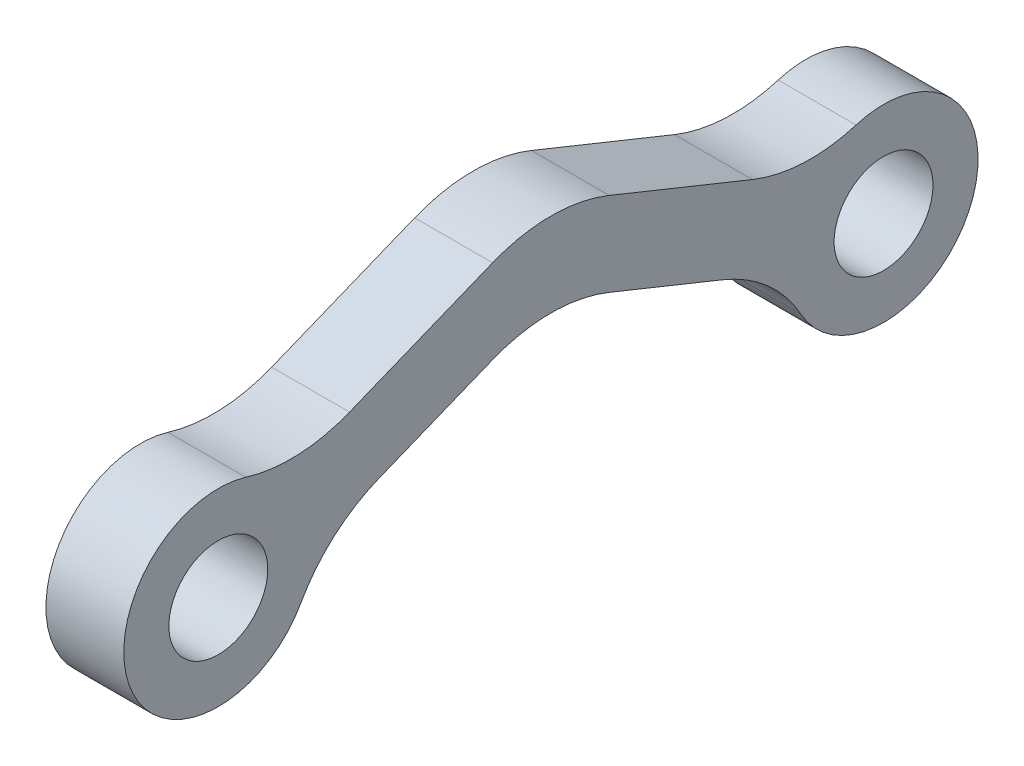
ISO-10303-21;
HEADER;
FILE_DESCRIPTION(('STEP AP214'),'2;1');
FILE_NAME('part.step','',(''),(''),'','','');
FILE_SCHEMA(('AUTOMOTIVE_DESIGN { 1 0 10303 214 1 1 1 1 }'));
ENDSEC;
DATA;
#1=APPLICATION_CONTEXT('core data for automotive mechanical design processes');
#2=APPLICATION_PROTOCOL_DEFINITION('international standard','automotive_design',2000,#1);
#3=PRODUCT_CONTEXT('',#1,'mechanical');
#4=PRODUCT('Part','Part','',(#3));
#5=PRODUCT_RELATED_PRODUCT_CATEGORY('part','',(#4));
#6=PRODUCT_DEFINITION_FORMATION('','',#4);
#7=PRODUCT_DEFINITION_CONTEXT('part definition',#1,'design');
#8=PRODUCT_DEFINITION('design','',#6,#7);
#9=PRODUCT_DEFINITION_SHAPE('','',#8);
#10=(LENGTH_UNIT() NAMED_UNIT(*) SI_UNIT(.MILLI.,.METRE.));
#11=(NAMED_UNIT(*) PLANE_ANGLE_UNIT() SI_UNIT($,.RADIAN.));
#12=(NAMED_UNIT(*) SI_UNIT($,.STERADIAN.) SOLID_ANGLE_UNIT());
#13=UNCERTAINTY_MEASURE_WITH_UNIT(LENGTH_MEASURE(1.E-05),#10,'distance_accuracy_value','');
#14=(GEOMETRIC_REPRESENTATION_CONTEXT(3) GLOBAL_UNCERTAINTY_ASSIGNED_CONTEXT((#13)) GLOBAL_UNIT_ASSIGNED_CONTEXT((#10,
#11,#12)) REPRESENTATION_CONTEXT('',''));
#15=CARTESIAN_POINT('',(0.,0.,0.));
#16=DIRECTION('',(0.,0.,1.));
#17=DIRECTION('',(1.,0.,0.));
#18=AXIS2_PLACEMENT_3D('',#15,#16,#17);
#19=CARTESIAN_POINT('',(5.,15.373044737521,38.0387186051064));
#20=DIRECTION('',(-1.,0.,0.));
#21=DIRECTION('',(0.,0.,1.));
#22=AXIS2_PLACEMENT_3D('',#19,#20,#21);
#23=PLANE('',#22);
#24=CARTESIAN_POINT('',(5.,15.373044737521,38.0387186051064));
#25=DIRECTION('',(-1.,0.,0.));
#26=DIRECTION('',(0.,0.,1.));
#27=AXIS2_PLACEMENT_3D('',#24,#25,#26);
#28=CIRCLE('',#27,10.);
#29=CARTESIAN_POINT('',(5.,6.10120619185315,34.2926526709472));
#30=VERTEX_POINT('',#29);
#31=CARTESIAN_POINT('',(5.,5.80674434080601,40.951774855818));
#32=VERTEX_POINT('',#31);
#33=EDGE_CURVE('E202',#30,#32,#28,.T.);
#34=ORIENTED_EDGE('',*,*,#33,.T.);
#35=CARTESIAN_POINT('',(5.,0.,42.72));
#36=DIRECTION('',(1.,0.,0.));
#37=DIRECTION('',(0.,0.,1.));
#38=AXIS2_PLACEMENT_3D('',#35,#36,#37);
#39=CIRCLE('',#38,6.07);
#40=CARTESIAN_POINT('',(5.,-2.9487099174709,37.414341716374));
#41=VERTEX_POINT('',#40);
#42=EDGE_CURVE('E114',#32,#41,#39,.T.);
#43=ORIENTED_EDGE('',*,*,#42,.T.);
#44=CARTESIAN_POINT('',(5.,-7.80655162664866,28.6735537697085));
#45=DIRECTION('',(-1.,0.,0.));
#46=DIRECTION('',(0.,0.,-1.));
#47=AXIS2_PLACEMENT_3D('',#44,#45,#46);
#48=CIRCLE('',#47,10.);
#49=CARTESIAN_POINT('',(5.,1.46528691901921,32.4196197038677));
#50=VERTEX_POINT('',#49);
#51=EDGE_CURVE('E239',#41,#50,#48,.T.);
#52=ORIENTED_EDGE('',*,*,#51,.T.);
#53=DIRECTION('',(0.,0.374606593415913,-0.927183854566787));
#54=VECTOR('',#53,1.);
#55=CARTESIAN_POINT('',(5.,1.46528691901921,32.4196197038677));
#56=LINE('',#55,#54);
#57=CARTESIAN_POINT('',(5.,4.42015444603704,25.1060659341591));
#58=VERTEX_POINT('',#57);
#59=EDGE_CURVE('E259',#50,#58,#56,.T.);
#60=ORIENTED_EDGE('',*,*,#59,.T.);
#61=CARTESIAN_POINT('',(5.,-4.85168409963083,21.36));
#62=DIRECTION('',(-1.,0.,0.));
#63=DIRECTION('',(0.,0.,-1.));
#64=AXIS2_PLACEMENT_3D('',#61,#62,#63);
#65=CIRCLE('',#64,10.);
#66=CARTESIAN_POINT('',(5.,4.42015444603704,17.6139340658409));
#67=VERTEX_POINT('',#66);
#68=EDGE_CURVE('E255',#58,#67,#65,.T.);
#69=ORIENTED_EDGE('',*,*,#68,.T.);
#70=DIRECTION('',(0.,-0.374606593415913,-0.927183854566787));
#71=VECTOR('',#70,1.);
#72=CARTESIAN_POINT('',(5.,1.46528691901921,10.3003802961323));
#73=LINE('',#72,#71);
#74=CARTESIAN_POINT('',(5.,1.46528691901921,10.3003802961323));
#75=VERTEX_POINT('',#74);
#76=EDGE_CURVE('E258',#67,#75,#73,.T.);
#77=ORIENTED_EDGE('',*,*,#76,.T.);
#78=CARTESIAN_POINT('',(5.,-7.80655162664866,14.0464462302915));
#79=DIRECTION('',(-1.,0.,0.));
#80=DIRECTION('',(0.,0.,1.));
#81=AXIS2_PLACEMENT_3D('',#78,#79,#80);
#82=CIRCLE('',#81,10.);
#83=CARTESIAN_POINT('',(5.,-2.9487099174709,5.30565828362596));
#84=VERTEX_POINT('',#83);
#85=EDGE_CURVE('E263',#75,#84,#82,.T.);
#86=ORIENTED_EDGE('',*,*,#85,.T.);
#87=CARTESIAN_POINT('',(5.,0.,0.));
#88=DIRECTION('',(1.,0.,0.));
#89=DIRECTION('',(0.,0.,-1.));
#90=AXIS2_PLACEMENT_3D('',#87,#88,#89);
#91=CIRCLE('',#90,6.07);
#92=CARTESIAN_POINT('',(5.,5.80674434080601,1.76822514418198));
#93=VERTEX_POINT('',#92);
#94=EDGE_CURVE('E270',#84,#93,#91,.T.);
#95=ORIENTED_EDGE('',*,*,#94,.T.);
#96=CARTESIAN_POINT('',(5.,15.373044737521,4.68128139489364));
#97=DIRECTION('',(-1.,0.,0.));
#98=DIRECTION('',(0.,0.,-1.));
#99=AXIS2_PLACEMENT_3D('',#96,#97,#98);
#100=CIRCLE('',#99,10.);
#101=CARTESIAN_POINT('',(5.,6.10120619185315,8.42734732905277));
#102=VERTEX_POINT('',#101);
#103=EDGE_CURVE('E145',#93,#102,#100,.T.);
#104=ORIENTED_EDGE('',*,*,#103,.T.);
#105=DIRECTION('',(0.,0.374606593415913,0.927183854566787));
#106=VECTOR('',#105,1.);
#107=CARTESIAN_POINT('',(5.,6.10120619185315,8.42734732905277));
#108=LINE('',#107,#106);
#109=CARTESIAN_POINT('',(5.,9.81282815942497,17.6139340658409));
#110=VERTEX_POINT('',#109);
#111=EDGE_CURVE('E139',#102,#110,#108,.T.);
#112=ORIENTED_EDGE('',*,*,#111,.T.);
#113=CARTESIAN_POINT('',(5.,0.540989613757094,21.36));
#114=DIRECTION('',(1.,0.,0.));
#115=DIRECTION('',(0.,0.,-1.));
#116=AXIS2_PLACEMENT_3D('',#113,#114,#115);
#117=CIRCLE('',#116,10.);
#118=CARTESIAN_POINT('',(5.,9.81282815942497,25.1060659341591));
#119=VERTEX_POINT('',#118);
#120=EDGE_CURVE('E143',#110,#119,#117,.T.);
#121=ORIENTED_EDGE('',*,*,#120,.T.);
#122=DIRECTION('',(0.,-0.374606593415913,0.927183854566787));
#123=VECTOR('',#122,1.);
#124=CARTESIAN_POINT('',(5.,6.10120619185315,34.2926526709472));
#125=LINE('',#124,#123);
#126=EDGE_CURVE('E59',#119,#30,#125,.T.);
#127=ORIENTED_EDGE('',*,*,#126,.T.);
#128=EDGE_LOOP('',(#34,#43,#52,#60,#69,#77,#86,#95,#104,#112,#121,#127));
#129=FACE_BOUND('',#128,.T.);
#130=CARTESIAN_POINT('',(5.,0.,0.));
#131=DIRECTION('',(1.,0.,0.));
#132=DIRECTION('',(0.,0.,-1.));
#133=AXIS2_PLACEMENT_3D('',#130,#131,#132);
#134=CIRCLE('',#133,3.175);
#135=CARTESIAN_POINT('',(5.,0.,-3.175));
#136=VERTEX_POINT('',#135);
#137=EDGE_CURVE('E172',#136,#136,#134,.T.);
#138=ORIENTED_EDGE('',*,*,#137,.F.);
#139=EDGE_LOOP('',(#138));
#140=FACE_BOUND('',#139,.T.);
#141=CARTESIAN_POINT('',(5.,0.,42.72));
#142=DIRECTION('',(1.,0.,0.));
#143=DIRECTION('',(0.,0.,-1.));
#144=AXIS2_PLACEMENT_3D('',#141,#142,#143);
#145=CIRCLE('',#144,3.175);
#146=CARTESIAN_POINT('',(5.,0.,39.545));
#147=VERTEX_POINT('',#146);
#148=EDGE_CURVE('E313',#147,#147,#145,.T.);
#149=ORIENTED_EDGE('',*,*,#148,.F.);
#150=EDGE_LOOP('',(#149));
#151=FACE_BOUND('',#150,.T.);
#152=ADVANCED_FACE('F41',(#129,#140,#151),#23,.F.);
#153=CARTESIAN_POINT('',(0.,15.373044737521,38.0387186051064));
#154=DIRECTION('',(-1.,0.,0.));
#155=DIRECTION('',(0.,0.,1.));
#156=AXIS2_PLACEMENT_3D('',#153,#154,#155);
#157=PLANE('',#156);
#158=CARTESIAN_POINT('',(0.,0.,0.));
#159=DIRECTION('',(1.,0.,0.));
#160=DIRECTION('',(0.,0.,-1.));
#161=AXIS2_PLACEMENT_3D('',#158,#159,#160);
#162=CIRCLE('',#161,3.175);
#163=CARTESIAN_POINT('',(0.,0.,-3.175));
#164=VERTEX_POINT('',#163);
#165=EDGE_CURVE('E320',#164,#164,#162,.T.);
#166=ORIENTED_EDGE('',*,*,#165,.T.);
#167=EDGE_LOOP('',(#166));
#168=FACE_BOUND('',#167,.T.);
#169=CARTESIAN_POINT('',(0.,15.373044737521,38.0387186051064));
#170=DIRECTION('',(-1.,0.,0.));
#171=DIRECTION('',(0.,0.,1.));
#172=AXIS2_PLACEMENT_3D('',#169,#170,#171);
#173=CIRCLE('',#172,10.);
#174=CARTESIAN_POINT('',(0.,6.10120619185315,34.2926526709472));
#175=VERTEX_POINT('',#174);
#176=CARTESIAN_POINT('',(0.,5.80674434080601,40.951774855818));
#177=VERTEX_POINT('',#176);
#178=EDGE_CURVE('E167',#175,#177,#173,.T.);
#179=ORIENTED_EDGE('',*,*,#178,.F.);
#180=DIRECTION('',(0.,-0.374606593415913,0.927183854566787));
#181=VECTOR('',#180,1.);
#182=CARTESIAN_POINT('',(0.,6.10120619185315,34.2926526709472));
#183=LINE('',#182,#181);
#184=CARTESIAN_POINT('',(0.,9.81282815942497,25.1060659341591));
#185=VERTEX_POINT('',#184);
#186=EDGE_CURVE('E106',#185,#175,#183,.T.);
#187=ORIENTED_EDGE('',*,*,#186,.F.);
#188=CARTESIAN_POINT('',(0.,0.540989613757094,21.36));
#189=DIRECTION('',(1.,0.,0.));
#190=DIRECTION('',(0.,0.,-1.));
#191=AXIS2_PLACEMENT_3D('',#188,#189,#190);
#192=CIRCLE('',#191,10.);
#193=CARTESIAN_POINT('',(0.,9.81282815942497,17.6139340658409));
#194=VERTEX_POINT('',#193);
#195=EDGE_CURVE('E100',#194,#185,#192,.T.);
#196=ORIENTED_EDGE('',*,*,#195,.F.);
#197=DIRECTION('',(0.,0.374606593415913,0.927183854566787));
#198=VECTOR('',#197,1.);
#199=CARTESIAN_POINT('',(0.,6.10120619185315,8.42734732905277));
#200=LINE('',#199,#198);
#201=CARTESIAN_POINT('',(0.,6.10120619185315,8.42734732905277));
#202=VERTEX_POINT('',#201);
#203=EDGE_CURVE('E154',#202,#194,#200,.T.);
#204=ORIENTED_EDGE('',*,*,#203,.F.);
#205=CARTESIAN_POINT('',(0.,15.373044737521,4.68128139489364));
#206=DIRECTION('',(-1.,0.,0.));
#207=DIRECTION('',(0.,0.,-1.));
#208=AXIS2_PLACEMENT_3D('',#205,#206,#207);
#209=CIRCLE('',#208,10.);
#210=CARTESIAN_POINT('',(0.,5.80674434080601,1.76822514418198));
#211=VERTEX_POINT('',#210);
#212=EDGE_CURVE('E193',#211,#202,#209,.T.);
#213=ORIENTED_EDGE('',*,*,#212,.F.);
#214=CARTESIAN_POINT('',(0.,0.,0.));
#215=DIRECTION('',(1.,0.,0.));
#216=DIRECTION('',(0.,0.,-1.));
#217=AXIS2_PLACEMENT_3D('',#214,#215,#216);
#218=CIRCLE('',#217,6.07);
#219=CARTESIAN_POINT('',(0.,-2.9487099174709,5.30565828362596));
#220=VERTEX_POINT('',#219);
#221=EDGE_CURVE('E190',#220,#211,#218,.T.);
#222=ORIENTED_EDGE('',*,*,#221,.F.);
#223=CARTESIAN_POINT('',(0.,-7.80655162664866,14.0464462302915));
#224=DIRECTION('',(-1.,0.,0.));
#225=DIRECTION('',(0.,0.,1.));
#226=AXIS2_PLACEMENT_3D('',#223,#224,#225);
#227=CIRCLE('',#226,10.);
#228=CARTESIAN_POINT('',(0.,1.46528691901921,10.3003802961323));
#229=VERTEX_POINT('',#228);
#230=EDGE_CURVE('E187',#229,#220,#227,.T.);
#231=ORIENTED_EDGE('',*,*,#230,.F.);
#232=DIRECTION('',(0.,-0.374606593415913,-0.927183854566787));
#233=VECTOR('',#232,1.);
#234=CARTESIAN_POINT('',(0.,1.46528691901921,10.3003802961323));
#235=LINE('',#234,#233);
#236=CARTESIAN_POINT('',(0.,4.42015444603704,17.6139340658409));
#237=VERTEX_POINT('',#236);
#238=EDGE_CURVE('E184',#237,#229,#235,.T.);
#239=ORIENTED_EDGE('',*,*,#238,.F.);
#240=CARTESIAN_POINT('',(0.,-4.85168409963083,21.36));
#241=DIRECTION('',(-1.,0.,0.));
#242=DIRECTION('',(0.,0.,-1.));
#243=AXIS2_PLACEMENT_3D('',#240,#241,#242);
#244=CIRCLE('',#243,10.);
#245=CARTESIAN_POINT('',(0.,4.42015444603704,25.1060659341591));
#246=VERTEX_POINT('',#245);
#247=EDGE_CURVE('E181',#246,#237,#244,.T.);
#248=ORIENTED_EDGE('',*,*,#247,.F.);
#249=DIRECTION('',(0.,0.374606593415913,-0.927183854566787));
#250=VECTOR('',#249,1.);
#251=CARTESIAN_POINT('',(0.,1.46528691901921,32.4196197038677));
#252=LINE('',#251,#250);
#253=CARTESIAN_POINT('',(0.,1.46528691901921,32.4196197038677));
#254=VERTEX_POINT('',#253);
#255=EDGE_CURVE('E178',#254,#246,#252,.T.);
#256=ORIENTED_EDGE('',*,*,#255,.F.);
#257=CARTESIAN_POINT('',(0.,-7.80655162664866,28.6735537697085));
#258=DIRECTION('',(-1.,0.,0.));
#259=DIRECTION('',(0.,0.,-1.));
#260=AXIS2_PLACEMENT_3D('',#257,#258,#259);
#261=CIRCLE('',#260,10.);
#262=CARTESIAN_POINT('',(0.,-2.9487099174709,37.414341716374));
#263=VERTEX_POINT('',#262);
#264=EDGE_CURVE('E175',#263,#254,#261,.T.);
#265=ORIENTED_EDGE('',*,*,#264,.F.);
#266=CARTESIAN_POINT('',(0.,0.,42.72));
#267=DIRECTION('',(1.,0.,0.));
#268=DIRECTION('',(0.,0.,1.));
#269=AXIS2_PLACEMENT_3D('',#266,#267,#268);
#270=CIRCLE('',#269,6.07);
#271=EDGE_CURVE('E171',#177,#263,#270,.T.);
#272=ORIENTED_EDGE('',*,*,#271,.F.);
#273=EDGE_LOOP('',(#179,#187,#196,#204,#213,#222,#231,#239,#248,#256,#265,#272));
#274=FACE_BOUND('',#273,.T.);
#275=CARTESIAN_POINT('',(0.,0.,42.72));
#276=DIRECTION('',(1.,0.,0.));
#277=DIRECTION('',(0.,0.,-1.));
#278=AXIS2_PLACEMENT_3D('',#275,#276,#277);
#279=CIRCLE('',#278,3.175);
#280=CARTESIAN_POINT('',(0.,0.,39.545));
#281=VERTEX_POINT('',#280);
#282=EDGE_CURVE('E316',#281,#281,#279,.T.);
#283=ORIENTED_EDGE('',*,*,#282,.T.);
#284=EDGE_LOOP('',(#283));
#285=FACE_BOUND('',#284,.T.);
#286=ADVANCED_FACE('F243',(#168,#274,#285),#157,.T.);
#287=CARTESIAN_POINT('',(5.,15.373044737521,38.0387186051064));
#288=DIRECTION('',(-1.,0.,0.));
#289=DIRECTION('',(0.,0.,1.));
#290=AXIS2_PLACEMENT_3D('',#287,#288,#289);
#291=CYLINDRICAL_SURFACE('',#290,10.);
#292=ORIENTED_EDGE('',*,*,#178,.T.);
#293=DIRECTION('',(-1.,0.,0.));
#294=VECTOR('',#293,1.);
#295=CARTESIAN_POINT('',(5.,5.80674434080601,40.951774855818));
#296=LINE('',#295,#294);
#297=EDGE_CURVE('E11',#32,#177,#296,.T.);
#298=ORIENTED_EDGE('',*,*,#297,.F.);
#299=ORIENTED_EDGE('',*,*,#33,.F.);
#300=DIRECTION('',(-1.,0.,0.));
#301=VECTOR('',#300,1.);
#302=CARTESIAN_POINT('',(5.,6.10120619185315,34.2926526709472));
#303=LINE('',#302,#301);
#304=EDGE_CURVE('E163',#30,#175,#303,.T.);
#305=ORIENTED_EDGE('',*,*,#304,.T.);
#306=EDGE_LOOP('',(#292,#298,#299,#305));
#307=FACE_BOUND('',#306,.T.);
#308=ADVANCED_FACE('F43',(#307),#291,.F.);
#309=CARTESIAN_POINT('',(5.,0.,42.72));
#310=DIRECTION('',(-1.,0.,0.));
#311=DIRECTION('',(0.,0.,1.));
#312=AXIS2_PLACEMENT_3D('',#309,#310,#311);
#313=CYLINDRICAL_SURFACE('',#312,6.07);
#314=ORIENTED_EDGE('',*,*,#271,.T.);
#315=DIRECTION('',(-1.,0.,0.));
#316=VECTOR('',#315,1.);
#317=CARTESIAN_POINT('',(5.,-2.9487099174709,37.414341716374));
#318=LINE('',#317,#316);
#319=EDGE_CURVE('E51',#41,#263,#318,.T.);
#320=ORIENTED_EDGE('',*,*,#319,.F.);
#321=ORIENTED_EDGE('',*,*,#42,.F.);
#322=ORIENTED_EDGE('',*,*,#297,.T.);
#323=EDGE_LOOP('',(#314,#320,#321,#322));
#324=FACE_BOUND('',#323,.T.);
#325=ADVANCED_FACE('F421',(#324),#313,.T.);
#326=CARTESIAN_POINT('',(5.,-7.80655162664866,28.6735537697085));
#327=DIRECTION('',(-1.,0.,0.));
#328=DIRECTION('',(0.,0.,1.));
#329=AXIS2_PLACEMENT_3D('',#326,#327,#328);
#330=CYLINDRICAL_SURFACE('',#329,10.);
#331=ORIENTED_EDGE('',*,*,#264,.T.);
#332=DIRECTION('',(-1.,0.,0.));
#333=VECTOR('',#332,1.);
#334=CARTESIAN_POINT('',(5.,1.46528691901921,32.4196197038677));
#335=LINE('',#334,#333);
#336=EDGE_CURVE('E229',#50,#254,#335,.T.);
#337=ORIENTED_EDGE('',*,*,#336,.F.);
#338=ORIENTED_EDGE('',*,*,#51,.F.);
#339=ORIENTED_EDGE('',*,*,#319,.T.);
#340=EDGE_LOOP('',(#331,#337,#338,#339));
#341=FACE_BOUND('',#340,.T.);
#342=ADVANCED_FACE('F237',(#341),#330,.F.);
#343=CARTESIAN_POINT('',(5.,1.46528691901921,32.4196197038677));
#344=DIRECTION('',(0.,0.927183854566787,0.374606593415913));
#345=DIRECTION('',(0.,-0.374606593415913,0.927183854566787));
#346=AXIS2_PLACEMENT_3D('',#343,#344,#345);
#347=PLANE('',#346);
#348=ORIENTED_EDGE('',*,*,#255,.T.);
#349=DIRECTION('',(-1.,0.,0.));
#350=VECTOR('',#349,1.);
#351=CARTESIAN_POINT('',(5.,4.42015444603704,25.1060659341591));
#352=LINE('',#351,#350);
#353=EDGE_CURVE('E225',#58,#246,#352,.T.);
#354=ORIENTED_EDGE('',*,*,#353,.F.);
#355=ORIENTED_EDGE('',*,*,#59,.F.);
#356=ORIENTED_EDGE('',*,*,#336,.T.);
#357=EDGE_LOOP('',(#348,#354,#355,#356));
#358=FACE_BOUND('',#357,.T.);
#359=ADVANCED_FACE('F249',(#358),#347,.F.);
#360=CARTESIAN_POINT('',(5.,-4.85168409963083,21.36));
#361=DIRECTION('',(-1.,0.,0.));
#362=DIRECTION('',(0.,0.,1.));
#363=AXIS2_PLACEMENT_3D('',#360,#361,#362);
#364=CYLINDRICAL_SURFACE('',#363,10.);
#365=ORIENTED_EDGE('',*,*,#247,.T.);
#366=DIRECTION('',(-1.,0.,0.));
#367=VECTOR('',#366,1.);
#368=CARTESIAN_POINT('',(5.,4.42015444603704,17.6139340658409));
#369=LINE('',#368,#367);
#370=EDGE_CURVE('E221',#67,#237,#369,.T.);
#371=ORIENTED_EDGE('',*,*,#370,.F.);
#372=ORIENTED_EDGE('',*,*,#68,.F.);
#373=ORIENTED_EDGE('',*,*,#353,.T.);
#374=EDGE_LOOP('',(#365,#371,#372,#373));
#375=FACE_BOUND('',#374,.T.);
#376=ADVANCED_FACE('F253',(#375),#364,.F.);
#377=CARTESIAN_POINT('',(5.,1.46528691901921,10.3003802961323));
#378=DIRECTION('',(0.,0.927183854566787,-0.374606593415913));
#379=DIRECTION('',(0.,0.374606593415913,0.927183854566787));
#380=AXIS2_PLACEMENT_3D('',#377,#378,#379);
#381=PLANE('',#380);
#382=ORIENTED_EDGE('',*,*,#238,.T.);
#383=DIRECTION('',(-1.,0.,0.));
#384=VECTOR('',#383,1.);
#385=CARTESIAN_POINT('',(5.,1.46528691901921,10.3003802961323));
#386=LINE('',#385,#384);
#387=EDGE_CURVE('E217',#75,#229,#386,.T.);
#388=ORIENTED_EDGE('',*,*,#387,.F.);
#389=ORIENTED_EDGE('',*,*,#76,.F.);
#390=ORIENTED_EDGE('',*,*,#370,.T.);
#391=EDGE_LOOP('',(#382,#388,#389,#390));
#392=FACE_BOUND('',#391,.T.);
#393=ADVANCED_FACE('F386',(#392),#381,.F.);
#394=CARTESIAN_POINT('',(5.,-7.80655162664866,14.0464462302915));
#395=DIRECTION('',(-1.,0.,0.));
#396=DIRECTION('',(0.,0.,1.));
#397=AXIS2_PLACEMENT_3D('',#394,#395,#396);
#398=CYLINDRICAL_SURFACE('',#397,10.);
#399=ORIENTED_EDGE('',*,*,#230,.T.);
#400=DIRECTION('',(-1.,0.,0.));
#401=VECTOR('',#400,1.);
#402=CARTESIAN_POINT('',(5.,-2.9487099174709,5.30565828362596));
#403=LINE('',#402,#401);
#404=EDGE_CURVE('E213',#84,#220,#403,.T.);
#405=ORIENTED_EDGE('',*,*,#404,.F.);
#406=ORIENTED_EDGE('',*,*,#85,.F.);
#407=ORIENTED_EDGE('',*,*,#387,.T.);
#408=EDGE_LOOP('',(#399,#405,#406,#407));
#409=FACE_BOUND('',#408,.T.);
#410=ADVANCED_FACE('F377',(#409),#398,.F.);
#411=CARTESIAN_POINT('',(5.,0.,0.));
#412=DIRECTION('',(-1.,0.,0.));
#413=DIRECTION('',(0.,0.,1.));
#414=AXIS2_PLACEMENT_3D('',#411,#412,#413);
#415=CYLINDRICAL_SURFACE('',#414,6.07);
#416=ORIENTED_EDGE('',*,*,#221,.T.);
#417=DIRECTION('',(-1.,0.,0.));
#418=VECTOR('',#417,1.);
#419=CARTESIAN_POINT('',(5.,5.80674434080601,1.76822514418198));
#420=LINE('',#419,#418);
#421=EDGE_CURVE('E209',#93,#211,#420,.T.);
#422=ORIENTED_EDGE('',*,*,#421,.F.);
#423=ORIENTED_EDGE('',*,*,#94,.F.);
#424=ORIENTED_EDGE('',*,*,#404,.T.);
#425=EDGE_LOOP('',(#416,#422,#423,#424));
#426=FACE_BOUND('',#425,.T.);
#427=ADVANCED_FACE('F278',(#426),#415,.T.);
#428=CARTESIAN_POINT('',(5.,15.373044737521,4.68128139489364));
#429=DIRECTION('',(-1.,0.,0.));
#430=DIRECTION('',(0.,0.,1.));
#431=AXIS2_PLACEMENT_3D('',#428,#429,#430);
#432=CYLINDRICAL_SURFACE('',#431,10.);
#433=ORIENTED_EDGE('',*,*,#212,.T.);
#434=DIRECTION('',(-1.,0.,0.));
#435=VECTOR('',#434,1.);
#436=CARTESIAN_POINT('',(5.,6.10120619185315,8.42734732905277));
#437=LINE('',#436,#435);
#438=EDGE_CURVE('E156',#102,#202,#437,.T.);
#439=ORIENTED_EDGE('',*,*,#438,.F.);
#440=ORIENTED_EDGE('',*,*,#103,.F.);
#441=ORIENTED_EDGE('',*,*,#421,.T.);
#442=EDGE_LOOP('',(#433,#439,#440,#441));
#443=FACE_BOUND('',#442,.T.);
#444=ADVANCED_FACE('F282',(#443),#432,.F.);
#445=CARTESIAN_POINT('',(5.,6.10120619185315,8.42734732905277));
#446=DIRECTION('',(0.,-0.927183854566787,0.374606593415913));
#447=DIRECTION('',(0.,-0.374606593415913,-0.927183854566787));
#448=AXIS2_PLACEMENT_3D('',#445,#446,#447);
#449=PLANE('',#448);
#450=ORIENTED_EDGE('',*,*,#203,.T.);
#451=DIRECTION('',(-1.,0.,0.));
#452=VECTOR('',#451,1.);
#453=CARTESIAN_POINT('',(5.,9.81282815942497,17.6139340658409));
#454=LINE('',#453,#452);
#455=EDGE_CURVE('E151',#110,#194,#454,.T.);
#456=ORIENTED_EDGE('',*,*,#455,.F.);
#457=ORIENTED_EDGE('',*,*,#111,.F.);
#458=ORIENTED_EDGE('',*,*,#438,.T.);
#459=EDGE_LOOP('',(#450,#456,#457,#458));
#460=FACE_BOUND('',#459,.T.);
#461=ADVANCED_FACE('F152',(#460),#449,.F.);
#462=CARTESIAN_POINT('',(5.,0.540989613757094,21.36));
#463=DIRECTION('',(-1.,0.,0.));
#464=DIRECTION('',(0.,0.,1.));
#465=AXIS2_PLACEMENT_3D('',#462,#463,#464);
#466=CYLINDRICAL_SURFACE('',#465,10.);
#467=ORIENTED_EDGE('',*,*,#195,.T.);
#468=DIRECTION('',(-1.,0.,0.));
#469=VECTOR('',#468,1.);
#470=CARTESIAN_POINT('',(5.,9.81282815942497,25.1060659341591));
#471=LINE('',#470,#469);
#472=EDGE_CURVE('E157',#119,#185,#471,.T.);
#473=ORIENTED_EDGE('',*,*,#472,.F.);
#474=ORIENTED_EDGE('',*,*,#120,.F.);
#475=ORIENTED_EDGE('',*,*,#455,.T.);
#476=EDGE_LOOP('',(#467,#473,#474,#475));
#477=FACE_BOUND('',#476,.T.);
#478=ADVANCED_FACE('F159',(#477),#466,.T.);
#479=CARTESIAN_POINT('',(5.,6.10120619185315,34.2926526709472));
#480=DIRECTION('',(0.,-0.927183854566787,-0.374606593415913));
#481=DIRECTION('',(0.,0.374606593415913,-0.927183854566787));
#482=AXIS2_PLACEMENT_3D('',#479,#480,#481);
#483=PLANE('',#482);
#484=ORIENTED_EDGE('',*,*,#186,.T.);
#485=ORIENTED_EDGE('',*,*,#304,.F.);
#486=ORIENTED_EDGE('',*,*,#126,.F.);
#487=ORIENTED_EDGE('',*,*,#472,.T.);
#488=EDGE_LOOP('',(#484,#485,#486,#487));
#489=FACE_BOUND('',#488,.T.);
#490=ADVANCED_FACE('F286',(#489),#483,.F.);
#491=CARTESIAN_POINT('',(5.,0.,0.));
#492=DIRECTION('',(-1.,0.,0.));
#493=DIRECTION('',(0.,0.,1.));
#494=AXIS2_PLACEMENT_3D('',#491,#492,#493);
#495=CYLINDRICAL_SURFACE('',#494,3.175);
#496=ORIENTED_EDGE('',*,*,#137,.T.);
#497=EDGE_LOOP('',(#496));
#498=FACE_BOUND('',#497,.T.);
#499=ORIENTED_EDGE('',*,*,#165,.F.);
#500=EDGE_LOOP('',(#499));
#501=FACE_BOUND('',#500,.T.);
#502=ADVANCED_FACE('F288',(#498,#501),#495,.F.);
#503=CARTESIAN_POINT('',(5.,0.,42.72));
#504=DIRECTION('',(-1.,0.,0.));
#505=DIRECTION('',(0.,0.,1.));
#506=AXIS2_PLACEMENT_3D('',#503,#504,#505);
#507=CYLINDRICAL_SURFACE('',#506,3.175);
#508=ORIENTED_EDGE('',*,*,#148,.T.);
#509=EDGE_LOOP('',(#508));
#510=FACE_BOUND('',#509,.T.);
#511=ORIENTED_EDGE('',*,*,#282,.F.);
#512=EDGE_LOOP('',(#511));
#513=FACE_BOUND('',#512,.T.);
#514=ADVANCED_FACE('F294',(#510,#513),#507,.F.);
#515=CLOSED_SHELL('',(#152,#286,#308,#325,#342,#359,#376,#393,#410,#427,#444,#461,#478,#490,
#502,#514));
#516=MANIFOLD_SOLID_BREP('B2',#515);
#517=ADVANCED_BREP_SHAPE_REPRESENTATION('',(#18,#516),#14);
#518=SHAPE_DEFINITION_REPRESENTATION(#9,#517);
ENDSEC;
END-ISO-10303-21;
